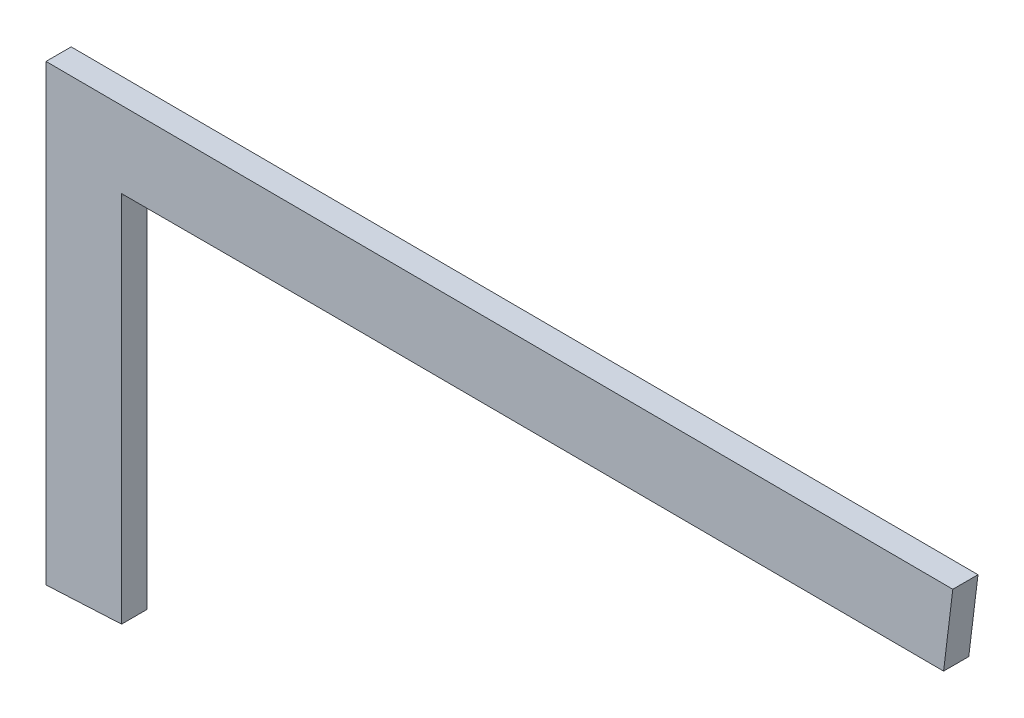
ISO-10303-21;
HEADER;
FILE_DESCRIPTION(('STEP AP214'),'2;1');
FILE_NAME('part.step','',(''),(''),'','','');
FILE_SCHEMA(('AUTOMOTIVE_DESIGN { 1 0 10303 214 1 1 1 1 }'));
ENDSEC;
DATA;
#1=APPLICATION_CONTEXT('core data for automotive mechanical design processes');
#2=APPLICATION_PROTOCOL_DEFINITION('international standard','automotive_design',2000,#1);
#3=PRODUCT_CONTEXT('',#1,'mechanical');
#4=PRODUCT('Part','Part','',(#3));
#5=PRODUCT_RELATED_PRODUCT_CATEGORY('part','',(#4));
#6=PRODUCT_DEFINITION_FORMATION('','',#4);
#7=PRODUCT_DEFINITION_CONTEXT('part definition',#1,'design');
#8=PRODUCT_DEFINITION('design','',#6,#7);
#9=PRODUCT_DEFINITION_SHAPE('','',#8);
#10=(LENGTH_UNIT() NAMED_UNIT(*) SI_UNIT(.MILLI.,.METRE.));
#11=(NAMED_UNIT(*) PLANE_ANGLE_UNIT() SI_UNIT($,.RADIAN.));
#12=(NAMED_UNIT(*) SI_UNIT($,.STERADIAN.) SOLID_ANGLE_UNIT());
#13=UNCERTAINTY_MEASURE_WITH_UNIT(LENGTH_MEASURE(1.E-05),#10,'distance_accuracy_value','');
#14=(GEOMETRIC_REPRESENTATION_CONTEXT(3) GLOBAL_UNCERTAINTY_ASSIGNED_CONTEXT((#13)) GLOBAL_UNIT_ASSIGNED_CONTEXT((#10,
#11,#12)) REPRESENTATION_CONTEXT('',''));
#15=CARTESIAN_POINT('',(0.,0.,0.));
#16=DIRECTION('',(0.,0.,1.));
#17=DIRECTION('',(1.,0.,0.));
#18=AXIS2_PLACEMENT_3D('',#15,#16,#17);
#19=CARTESIAN_POINT('',(87.2304639601893,-14.1012884790918,5.));
#20=DIRECTION('',(-0.992634489725069,0.121147718956038,0.));
#21=DIRECTION('',(-0.121147718956038,-0.992634489725069,0.));
#22=AXIS2_PLACEMENT_3D('',#19,#20,#21);
#23=PLANE('',#22);
#24=DIRECTION('',(0.121147718956038,0.992634489725069,0.));
#25=VECTOR('',#24,1.);
#26=CARTESIAN_POINT('',(87.2304639601893,-14.1012884790918,0.));
#27=LINE('',#26,#25);
#28=CARTESIAN_POINT('',(87.2304639601893,-14.1012884790918,0.));
#29=VERTEX_POINT('',#28);
#30=CARTESIAN_POINT('',(89.0602606174448,0.891311355450643,0.));
#31=VERTEX_POINT('',#30);
#32=EDGE_CURVE('E129',#29,#31,#27,.T.);
#33=ORIENTED_EDGE('',*,*,#32,.T.);
#34=DIRECTION('',(0.,0.,-1.));
#35=VECTOR('',#34,1.);
#36=CARTESIAN_POINT('',(89.0602606174448,0.891311355450643,5.));
#37=LINE('',#36,#35);
#38=CARTESIAN_POINT('',(89.0602606174448,0.891311355450643,5.));
#39=VERTEX_POINT('',#38);
#40=EDGE_CURVE('E11',#39,#31,#37,.T.);
#41=ORIENTED_EDGE('',*,*,#40,.F.);
#42=DIRECTION('',(0.121147718956038,0.992634489725069,0.));
#43=VECTOR('',#42,1.);
#44=CARTESIAN_POINT('',(87.2304639601893,-14.1012884790918,5.));
#45=LINE('',#44,#43);
#46=CARTESIAN_POINT('',(87.2304639601893,-14.1012884790918,5.));
#47=VERTEX_POINT('',#46);
#48=EDGE_CURVE('E143',#47,#39,#45,.T.);
#49=ORIENTED_EDGE('',*,*,#48,.F.);
#50=DIRECTION('',(0.,0.,-1.));
#51=VECTOR('',#50,1.);
#52=CARTESIAN_POINT('',(87.2304639601893,-14.1012884790918,5.));
#53=LINE('',#52,#51);
#54=EDGE_CURVE('E125',#47,#29,#53,.T.);
#55=ORIENTED_EDGE('',*,*,#54,.T.);
#56=EDGE_LOOP('',(#33,#41,#49,#55));
#57=FACE_BOUND('',#56,.T.);
#58=ADVANCED_FACE('F33',(#57),#23,.F.);
#59=CARTESIAN_POINT('',(89.0602606174448,0.891311355450643,5.));
#60=DIRECTION('',(-0.00411358000171734,-0.999991539193992,0.));
#61=DIRECTION('',(0.999991539193992,-0.00411358000171734,0.));
#62=AXIS2_PLACEMENT_3D('',#59,#60,#61);
#63=PLANE('',#62);
#64=DIRECTION('',(-0.999991539193992,0.00411358000171734,0.));
#65=VECTOR('',#64,1.);
#66=CARTESIAN_POINT('',(89.0602606174448,0.891311355450643,0.));
#67=LINE('',#66,#65);
#68=CARTESIAN_POINT('',(-90.9397393825552,1.6317620205692,0.));
#69=VERTEX_POINT('',#68);
#70=EDGE_CURVE('E132',#31,#69,#67,.T.);
#71=ORIENTED_EDGE('',*,*,#70,.T.);
#72=DIRECTION('',(0.,0.,-1.));
#73=VECTOR('',#72,1.);
#74=CARTESIAN_POINT('',(-90.9397393825552,1.6317620205692,5.));
#75=LINE('',#74,#73);
#76=CARTESIAN_POINT('',(-90.9397393825552,1.6317620205692,5.));
#77=VERTEX_POINT('',#76);
#78=EDGE_CURVE('E41',#77,#69,#75,.T.);
#79=ORIENTED_EDGE('',*,*,#78,.F.);
#80=DIRECTION('',(-0.999991539193992,0.00411358000171734,0.));
#81=VECTOR('',#80,1.);
#82=CARTESIAN_POINT('',(89.0602606174448,0.891311355450643,5.));
#83=LINE('',#82,#81);
#84=EDGE_CURVE('E92',#39,#77,#83,.T.);
#85=ORIENTED_EDGE('',*,*,#84,.F.);
#86=ORIENTED_EDGE('',*,*,#40,.T.);
#87=EDGE_LOOP('',(#71,#79,#85,#86));
#88=FACE_BOUND('',#87,.T.);
#89=ADVANCED_FACE('F178',(#88),#63,.F.);
#90=CARTESIAN_POINT('',(-90.9397393825552,1.6317620205692,5.));
#91=DIRECTION('',(1.,0.,0.));
#92=DIRECTION('',(0.,1.,0.));
#93=AXIS2_PLACEMENT_3D('',#90,#91,#92);
#94=PLANE('',#93);
#95=DIRECTION('',(0.,-1.,0.));
#96=VECTOR('',#95,1.);
#97=CARTESIAN_POINT('',(-90.9397393825552,1.6317620205692,0.));
#98=LINE('',#97,#96);
#99=CARTESIAN_POINT('',(-90.9397393825551,-88.3682379794308,0.));
#100=VERTEX_POINT('',#99);
#101=EDGE_CURVE('E134',#69,#100,#98,.T.);
#102=ORIENTED_EDGE('',*,*,#101,.T.);
#103=DIRECTION('',(0.,0.,-1.));
#104=VECTOR('',#103,1.);
#105=CARTESIAN_POINT('',(-90.9397393825551,-88.3682379794308,5.));
#106=LINE('',#105,#104);
#107=CARTESIAN_POINT('',(-90.9397393825551,-88.3682379794308,5.));
#108=VERTEX_POINT('',#107);
#109=EDGE_CURVE('E150',#108,#100,#106,.T.);
#110=ORIENTED_EDGE('',*,*,#109,.F.);
#111=DIRECTION('',(0.,-1.,0.));
#112=VECTOR('',#111,1.);
#113=CARTESIAN_POINT('',(-90.9397393825552,1.6317620205692,5.));
#114=LINE('',#113,#112);
#115=EDGE_CURVE('E158',#77,#108,#114,.T.);
#116=ORIENTED_EDGE('',*,*,#115,.F.);
#117=ORIENTED_EDGE('',*,*,#78,.T.);
#118=EDGE_LOOP('',(#102,#110,#116,#117));
#119=FACE_BOUND('',#118,.T.);
#120=ADVANCED_FACE('F156',(#119),#94,.F.);
#121=CARTESIAN_POINT('',(-90.9397393825551,-88.3682379794308,5.));
#122=DIRECTION('',(-0.0504455029972153,0.998726815113802,0.));
#123=DIRECTION('',(-0.998726815113802,-0.0504455029972153,0.));
#124=AXIS2_PLACEMENT_3D('',#121,#122,#123);
#125=PLANE('',#124);
#126=DIRECTION('',(0.998726815113802,0.0504455029972153,0.));
#127=VECTOR('',#126,1.);
#128=CARTESIAN_POINT('',(-90.9397393825551,-88.3682379794308,0.));
#129=LINE('',#128,#127);
#130=CARTESIAN_POINT('',(-75.9397393825552,-87.6105908095468,0.));
#131=VERTEX_POINT('',#130);
#132=EDGE_CURVE('E136',#100,#131,#129,.T.);
#133=ORIENTED_EDGE('',*,*,#132,.T.);
#134=DIRECTION('',(0.,0.,-1.));
#135=VECTOR('',#134,1.);
#136=CARTESIAN_POINT('',(-75.9397393825552,-87.6105908095468,5.));
#137=LINE('',#136,#135);
#138=CARTESIAN_POINT('',(-75.9397393825552,-87.6105908095468,5.));
#139=VERTEX_POINT('',#138);
#140=EDGE_CURVE('E147',#139,#131,#137,.T.);
#141=ORIENTED_EDGE('',*,*,#140,.F.);
#142=DIRECTION('',(0.998726815113802,0.0504455029972153,0.));
#143=VECTOR('',#142,1.);
#144=CARTESIAN_POINT('',(-90.9397393825551,-88.3682379794308,5.));
#145=LINE('',#144,#143);
#146=EDGE_CURVE('E170',#108,#139,#145,.T.);
#147=ORIENTED_EDGE('',*,*,#146,.F.);
#148=ORIENTED_EDGE('',*,*,#109,.T.);
#149=EDGE_LOOP('',(#133,#141,#147,#148));
#150=FACE_BOUND('',#149,.T.);
#151=ADVANCED_FACE('F166',(#150),#125,.F.);
#152=CARTESIAN_POINT('',(-75.9397393825552,-87.6105908095468,5.));
#153=DIRECTION('',(-1.,0.,0.));
#154=DIRECTION('',(0.,0.,1.));
#155=AXIS2_PLACEMENT_3D('',#152,#153,#154);
#156=PLANE('',#155);
#157=DIRECTION('',(0.,1.,0.));
#158=VECTOR('',#157,1.);
#159=CARTESIAN_POINT('',(-75.9397393825552,-87.6105908095468,0.));
#160=LINE('',#159,#158);
#161=CARTESIAN_POINT('',(-75.9397393825552,-14.1012884790918,0.));
#162=VERTEX_POINT('',#161);
#163=EDGE_CURVE('E138',#131,#162,#160,.T.);
#164=ORIENTED_EDGE('',*,*,#163,.T.);
#165=DIRECTION('',(0.,0.,-1.));
#166=VECTOR('',#165,1.);
#167=CARTESIAN_POINT('',(-75.9397393825552,-14.1012884790918,5.));
#168=LINE('',#167,#166);
#169=CARTESIAN_POINT('',(-75.9397393825552,-14.1012884790918,5.));
#170=VERTEX_POINT('',#169);
#171=EDGE_CURVE('E120',#170,#162,#168,.T.);
#172=ORIENTED_EDGE('',*,*,#171,.F.);
#173=DIRECTION('',(0.,1.,0.));
#174=VECTOR('',#173,1.);
#175=CARTESIAN_POINT('',(-75.9397393825552,-87.6105908095468,5.));
#176=LINE('',#175,#174);
#177=EDGE_CURVE('E111',#139,#170,#176,.T.);
#178=ORIENTED_EDGE('',*,*,#177,.F.);
#179=ORIENTED_EDGE('',*,*,#140,.T.);
#180=EDGE_LOOP('',(#164,#172,#178,#179));
#181=FACE_BOUND('',#180,.T.);
#182=ADVANCED_FACE('F169',(#181),#156,.F.);
#183=CARTESIAN_POINT('',(-75.9438364982298,-13.5879434168469,5.));
#184=DIRECTION('',(-0.999968151650544,-0.00798095762393357,0.));
#185=DIRECTION('',(0.00798095762393357,-0.999968151650544,0.));
#186=AXIS2_PLACEMENT_3D('',#183,#184,#185);
#187=PLANE('',#186);
#188=DIRECTION('',(-0.00798095762393357,0.999968151650544,0.));
#189=VECTOR('',#188,1.);
#190=CARTESIAN_POINT('',(-75.9438364982298,-13.5879434168469,0.));
#191=LINE('',#190,#189);
#192=CARTESIAN_POINT('',(-75.9438364982298,-13.5879434168469,0.));
#193=VERTEX_POINT('',#192);
#194=EDGE_CURVE('E119',#162,#193,#191,.T.);
#195=ORIENTED_EDGE('',*,*,#194,.T.);
#196=DIRECTION('',(0.,0.,-1.));
#197=VECTOR('',#196,1.);
#198=CARTESIAN_POINT('',(-75.9438364982298,-13.5879434168469,5.));
#199=LINE('',#198,#197);
#200=CARTESIAN_POINT('',(-75.9438364982298,-13.5879434168469,5.));
#201=VERTEX_POINT('',#200);
#202=EDGE_CURVE('E116',#201,#193,#199,.T.);
#203=ORIENTED_EDGE('',*,*,#202,.F.);
#204=DIRECTION('',(-0.00798095762393357,0.999968151650544,0.));
#205=VECTOR('',#204,1.);
#206=CARTESIAN_POINT('',(-75.9438364982298,-13.5879434168469,5.));
#207=LINE('',#206,#205);
#208=EDGE_CURVE('E105',#170,#201,#207,.T.);
#209=ORIENTED_EDGE('',*,*,#208,.F.);
#210=ORIENTED_EDGE('',*,*,#171,.T.);
#211=EDGE_LOOP('',(#195,#203,#209,#210));
#212=FACE_BOUND('',#211,.T.);
#213=ADVANCED_FACE('F117',(#212),#187,.F.);
#214=CARTESIAN_POINT('',(-37.5612548632059,-13.5879434168469,5.));
#215=DIRECTION('',(0.,1.,0.));
#216=DIRECTION('',(0.,0.,1.));
#217=AXIS2_PLACEMENT_3D('',#214,#215,#216);
#218=PLANE('',#217);
#219=DIRECTION('',(1.,0.,0.));
#220=VECTOR('',#219,1.);
#221=CARTESIAN_POINT('',(-37.5612548632059,-13.5879434168469,0.));
#222=LINE('',#221,#220);
#223=CARTESIAN_POINT('',(-37.5612548632059,-13.5879434168469,0.));
#224=VERTEX_POINT('',#223);
#225=EDGE_CURVE('E78',#193,#224,#222,.T.);
#226=ORIENTED_EDGE('',*,*,#225,.T.);
#227=DIRECTION('',(0.,0.,-1.));
#228=VECTOR('',#227,1.);
#229=CARTESIAN_POINT('',(-37.5612548632059,-13.5879434168469,5.));
#230=LINE('',#229,#228);
#231=CARTESIAN_POINT('',(-37.5612548632059,-13.5879434168469,5.));
#232=VERTEX_POINT('',#231);
#233=EDGE_CURVE('E121',#232,#224,#230,.T.);
#234=ORIENTED_EDGE('',*,*,#233,.F.);
#235=DIRECTION('',(1.,0.,0.));
#236=VECTOR('',#235,1.);
#237=CARTESIAN_POINT('',(-37.5612548632059,-13.5879434168469,5.));
#238=LINE('',#237,#236);
#239=EDGE_CURVE('E109',#201,#232,#238,.T.);
#240=ORIENTED_EDGE('',*,*,#239,.F.);
#241=ORIENTED_EDGE('',*,*,#202,.T.);
#242=EDGE_LOOP('',(#226,#234,#240,#241));
#243=FACE_BOUND('',#242,.T.);
#244=ADVANCED_FACE('F123',(#243),#218,.F.);
#245=CARTESIAN_POINT('',(87.2304639601893,-14.1012884790918,5.));
#246=DIRECTION('',(0.00411358000171733,0.999991539193992,0.));
#247=DIRECTION('',(-0.999991539193992,0.00411358000171733,0.));
#248=AXIS2_PLACEMENT_3D('',#245,#246,#247);
#249=PLANE('',#248);
#250=DIRECTION('',(0.999991539193992,-0.00411358000171733,0.));
#251=VECTOR('',#250,1.);
#252=CARTESIAN_POINT('',(87.2304639601893,-14.1012884790918,0.));
#253=LINE('',#252,#251);
#254=EDGE_CURVE('E84',#224,#29,#253,.T.);
#255=ORIENTED_EDGE('',*,*,#254,.T.);
#256=ORIENTED_EDGE('',*,*,#54,.F.);
#257=DIRECTION('',(0.999991539193992,-0.00411358000171733,0.));
#258=VECTOR('',#257,1.);
#259=CARTESIAN_POINT('',(87.2304639601893,-14.1012884790918,5.));
#260=LINE('',#259,#258);
#261=EDGE_CURVE('E49',#232,#47,#260,.T.);
#262=ORIENTED_EDGE('',*,*,#261,.F.);
#263=ORIENTED_EDGE('',*,*,#233,.T.);
#264=EDGE_LOOP('',(#255,#256,#262,#263));
#265=FACE_BOUND('',#264,.T.);
#266=ADVANCED_FACE('F194',(#265),#249,.F.);
#267=CARTESIAN_POINT('',(0.,0.,5.));
#268=DIRECTION('',(0.,0.,1.));
#269=DIRECTION('',(1.,0.,0.));
#270=AXIS2_PLACEMENT_3D('',#267,#268,#269);
#271=PLANE('',#270);
#272=ORIENTED_EDGE('',*,*,#48,.T.);
#273=ORIENTED_EDGE('',*,*,#84,.T.);
#274=ORIENTED_EDGE('',*,*,#115,.T.);
#275=ORIENTED_EDGE('',*,*,#146,.T.);
#276=ORIENTED_EDGE('',*,*,#177,.T.);
#277=ORIENTED_EDGE('',*,*,#208,.T.);
#278=ORIENTED_EDGE('',*,*,#239,.T.);
#279=ORIENTED_EDGE('',*,*,#261,.T.);
#280=EDGE_LOOP('',(#272,#273,#274,#275,#276,#277,#278,#279));
#281=FACE_BOUND('',#280,.T.);
#282=ADVANCED_FACE('F107',(#281),#271,.T.);
#283=CARTESIAN_POINT('',(0.,0.,0.));
#284=DIRECTION('',(0.,0.,1.));
#285=DIRECTION('',(1.,0.,0.));
#286=AXIS2_PLACEMENT_3D('',#283,#284,#285);
#287=PLANE('',#286);
#288=ORIENTED_EDGE('',*,*,#32,.F.);
#289=ORIENTED_EDGE('',*,*,#254,.F.);
#290=ORIENTED_EDGE('',*,*,#225,.F.);
#291=ORIENTED_EDGE('',*,*,#194,.F.);
#292=ORIENTED_EDGE('',*,*,#163,.F.);
#293=ORIENTED_EDGE('',*,*,#132,.F.);
#294=ORIENTED_EDGE('',*,*,#101,.F.);
#295=ORIENTED_EDGE('',*,*,#70,.F.);
#296=EDGE_LOOP('',(#288,#289,#290,#291,#292,#293,#294,#295));
#297=FACE_BOUND('',#296,.T.);
#298=ADVANCED_FACE('F162',(#297),#287,.F.);
#299=CLOSED_SHELL('',(#58,#89,#120,#151,#182,#213,#244,#266,#282,#298));
#300=MANIFOLD_SOLID_BREP('B2',#299);
#301=ADVANCED_BREP_SHAPE_REPRESENTATION('',(#18,#300),#14);
#302=SHAPE_DEFINITION_REPRESENTATION(#9,#301);
ENDSEC;
END-ISO-10303-21;
